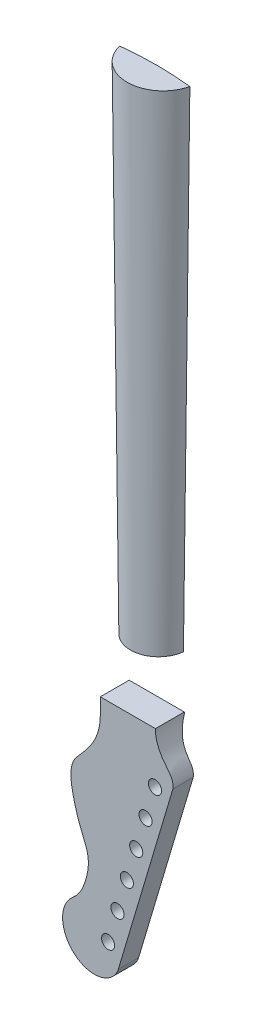
ISO-10303-21;
HEADER;
FILE_DESCRIPTION(('STEP AP214'),'2;1');
FILE_NAME('part.step','',(''),(''),'','','');
FILE_SCHEMA(('AUTOMOTIVE_DESIGN { 1 0 10303 214 1 1 1 1 }'));
ENDSEC;
DATA;
#1=APPLICATION_CONTEXT('core data for automotive mechanical design processes');
#2=APPLICATION_PROTOCOL_DEFINITION('international standard','automotive_design',2000,#1);
#3=PRODUCT_CONTEXT('',#1,'mechanical');
#4=PRODUCT('Part','Part','',(#3));
#5=PRODUCT_RELATED_PRODUCT_CATEGORY('part','',(#4));
#6=PRODUCT_DEFINITION_FORMATION('','',#4);
#7=PRODUCT_DEFINITION_CONTEXT('part definition',#1,'design');
#8=PRODUCT_DEFINITION('design','',#6,#7);
#9=PRODUCT_DEFINITION_SHAPE('','',#8);
#10=(LENGTH_UNIT() NAMED_UNIT(*) SI_UNIT(.MILLI.,.METRE.));
#11=(NAMED_UNIT(*) PLANE_ANGLE_UNIT() SI_UNIT($,.RADIAN.));
#12=(NAMED_UNIT(*) SI_UNIT($,.STERADIAN.) SOLID_ANGLE_UNIT());
#13=UNCERTAINTY_MEASURE_WITH_UNIT(LENGTH_MEASURE(1.E-05),#10,'distance_accuracy_value','');
#14=(GEOMETRIC_REPRESENTATION_CONTEXT(3) GLOBAL_UNCERTAINTY_ASSIGNED_CONTEXT((#13)) GLOBAL_UNIT_ASSIGNED_CONTEXT((#10,
#11,#12)) REPRESENTATION_CONTEXT('',''));
#15=CARTESIAN_POINT('',(0.,0.,0.));
#16=DIRECTION('',(0.,0.,1.));
#17=DIRECTION('',(1.,0.,0.));
#18=AXIS2_PLACEMENT_3D('',#15,#16,#17);
#19=CARTESIAN_POINT('',(56.6375080453473,-20.3369897013631,0.));
#20=DIRECTION('',(0.,0.,-1.));
#21=DIRECTION('',(-1.,0.,0.));
#22=AXIS2_PLACEMENT_3D('',#19,#20,#21);
#23=PLANE('',#22);
#24=CARTESIAN_POINT('',(64.4678967595988,-36.3869171248618,0.));
#25=CARTESIAN_POINT('',(65.2962653016021,-30.5662360862277,0.));
#26=CARTESIAN_POINT('',(56.4837621605687,-22.0007319523904,0.));
#27=CARTESIAN_POINT('',(50.9375501111084,-10.7673234647444,0.));
#28=CARTESIAN_POINT('',(51.151028,-3.25,0.));
#29=B_SPLINE_CURVE_WITH_KNOTS('',3,(#24,#25,#26,#27,#28),.UNSPECIFIED.,.F.,.F.,(4,1,4),(0.,
0.401837933237775,1.),.UNSPECIFIED.);
#30=CARTESIAN_POINT('',(51.1549542125218,-4.75,0.));
#31=VERTEX_POINT('',#30);
#32=CARTESIAN_POINT('',(51.151028,-3.25,0.));
#33=VERTEX_POINT('',#32);
#34=EDGE_CURVE('E241',#31,#33,#29,.T.);
#35=ORIENTED_EDGE('',*,*,#34,.F.);
#36=DIRECTION('',(-1.,0.,0.));
#37=VECTOR('',#36,1.);
#38=CARTESIAN_POINT('',(89.,-4.75,0.));
#39=LINE('',#38,#37);
#40=CARTESIAN_POINT('',(9.14908,-4.75,0.));
#41=VERTEX_POINT('',#40);
#42=EDGE_CURVE('E175',#31,#41,#39,.T.);
#43=ORIENTED_EDGE('',*,*,#42,.T.);
#44=DIRECTION('',(0.,-1.,0.));
#45=VECTOR('',#44,1.);
#46=CARTESIAN_POINT('',(9.14908,-3.25,0.));
#47=LINE('',#46,#45);
#48=CARTESIAN_POINT('',(9.14908,-3.25,0.));
#49=VERTEX_POINT('',#48);
#50=EDGE_CURVE('E157',#49,#41,#47,.T.);
#51=ORIENTED_EDGE('',*,*,#50,.F.);
#52=DIRECTION('',(-1.,0.,0.));
#53=VECTOR('',#52,1.);
#54=CARTESIAN_POINT('',(51.151028,-3.25,0.));
#55=LINE('',#54,#53);
#56=EDGE_CURVE('E321',#33,#49,#55,.T.);
#57=ORIENTED_EDGE('',*,*,#56,.F.);
#58=EDGE_LOOP('',(#35,#43,#51,#57));
#59=FACE_BOUND('',#58,.T.);
#60=ADVANCED_FACE('F51',(#59),#23,.T.);
#61=CARTESIAN_POINT('',(64.4678967595988,-36.3869171248618,22.));
#62=CARTESIAN_POINT('',(65.2962653016021,-30.5662360862277,22.));
#63=CARTESIAN_POINT('',(56.4837621605687,-22.0007319523904,22.));
#64=CARTESIAN_POINT('',(50.9375501111084,-10.7673234647444,22.));
#65=CARTESIAN_POINT('',(51.151028,-3.25,22.));
#66=B_SPLINE_CURVE_WITH_KNOTS('',3,(#61,#62,#63,#64,#65),.UNSPECIFIED.,.F.,.F.,(4,1,4),(0.,
0.401837933237775,1.),.UNSPECIFIED.);
#67=DIRECTION('',(0.,0.,-1.));
#68=VECTOR('',#67,1.);
#69=SURFACE_OF_LINEAR_EXTRUSION('',#66,#68);
#70=CARTESIAN_POINT('',(51.1549542125218,-4.75000002359859,4.21852207528305E-09));
#71=CARTESIAN_POINT('',(51.1680654468338,-5.14091643297609,0.150058757586606));
#72=CARTESIAN_POINT('',(51.1906814220311,-5.53154264494164,0.300006112774302));
#73=CARTESIAN_POINT('',(51.2545517430317,-6.31103438426002,0.599224958035812));
#74=CARTESIAN_POINT('',(51.2957855595916,-6.69990137569232,0.748497010118848));
#75=CARTESIAN_POINT('',(51.3965222496747,-7.4753379481485,1.04615922148701));
#76=CARTESIAN_POINT('',(51.4560147588833,-7.86190870602771,1.19454983252432));
#77=CARTESIAN_POINT('',(51.5927661422065,-8.63223932063184,1.4902520506242));
#78=CARTESIAN_POINT('',(51.6700224611351,-9.01599957344202,1.63756380972966));
#79=CARTESIAN_POINT('',(51.840038295133,-9.77272447515635,1.92804328389599));
#80=CARTESIAN_POINT('',(51.9324673798035,-10.1457539953343,2.07123590070518));
#81=CARTESIAN_POINT('',(52.1332053641683,-10.8881343898938,2.3562090344966));
#82=CARTESIAN_POINT('',(52.2415170784595,-11.2574845998414,2.49798929642658));
#83=CARTESIAN_POINT('',(52.4733131476984,-11.9920514774737,2.77996310207662));
#84=CARTESIAN_POINT('',(52.5967992872388,-12.3572676534475,2.92015645704661));
#85=CARTESIAN_POINT('',(52.8581714686001,-13.0831318388325,3.1987896121365));
#86=CARTESIAN_POINT('',(52.9960560072269,-13.443780320712,3.33722959362004));
#87=CARTESIAN_POINT('',(53.2798751215128,-14.1464328261318,3.60695261957817));
#88=CARTESIAN_POINT('',(53.4252932601499,-14.4886190444293,3.73830560206738));
#89=CARTESIAN_POINT('',(53.7280288740928,-15.1683273649276,3.99922118062102));
#90=CARTESIAN_POINT('',(53.8853451725619,-15.5058499245114,4.12878395225833));
#91=CARTESIAN_POINT('',(54.2112200264707,-16.176167239746,4.38609466163837));
#92=CARTESIAN_POINT('',(54.3797797481468,-16.5089615005924,4.51384240944352));
#93=CARTESIAN_POINT('',(54.7274837219142,-17.1697600424618,4.76749920407103));
#94=CARTESIAN_POINT('',(54.9066297805539,-17.4977634939578,4.89340793246781));
#95=CARTESIAN_POINT('',(55.2784161795221,-18.1552291549036,5.1457853539757));
#96=CARTESIAN_POINT('',(55.4712514860682,-18.4845951773182,5.27221712434334));
#97=CARTESIAN_POINT('',(55.8665364925132,-19.1382184097607,5.52311957574163));
#98=CARTESIAN_POINT('',(56.0689853946862,-19.4624760407143,5.64759041835047));
#99=CARTESIAN_POINT('',(56.4827947449292,-20.1058151737395,5.89454517384971));
#100=CARTESIAN_POINT('',(56.6941516381016,-20.4248986715523,6.01702985283335));
#101=CARTESIAN_POINT('',(57.1250817005319,-21.057828828609,6.25998897681674));
#102=CARTESIAN_POINT('',(57.3446480064048,-21.371679558657,6.38046498445179));
#103=CARTESIAN_POINT('',(57.5681076748866,-21.6830789205097,6.5));
#104=B_SPLINE_CURVE_WITH_KNOTS('',3,(#70,#71,#72,#73,#74,#75,#76,#77,#78,#79,#80,#81,#82,#83,
#84,#85,#86,#87,#88,#89,#90,#91,#92,#93,#94,#95,#96,#97,#98,#99,#100,#101,#102,#103),
.UNSPECIFIED.,.F.,.F.,(4,2,2,2,2,2,2,2,2,2,2,2,2,2,2,2,4),(0.,1.25667336214889,2.51196440576778,
3.76654421316922,5.02094367178069,6.25096763315607,7.48120983387477,8.71159685628633,
9.94185555435961,11.1246089514657,12.3072455160601,13.4900049422633,14.6729667913902,
15.8789869484353,17.0849072054945,18.2903506920355,19.4948079783741),.UNSPECIFIED.);
#105=CARTESIAN_POINT('',(53.9451946415747,-15.627067259028,4.17531492740211));
#106=VERTEX_POINT('',#105);
#107=EDGE_CURVE('E293',#31,#106,#104,.T.);
#108=ORIENTED_EDGE('',*,*,#107,.F.);
#109=ORIENTED_EDGE('',*,*,#34,.T.);
#110=DIRECTION('',(0.,0.,-1.));
#111=VECTOR('',#110,1.);
#112=CARTESIAN_POINT('',(51.151028,-3.25,22.));
#113=LINE('',#112,#111);
#114=CARTESIAN_POINT('',(51.151028,-3.25,22.));
#115=VERTEX_POINT('',#114);
#116=EDGE_CURVE('E164',#115,#33,#113,.T.);
#117=ORIENTED_EDGE('',*,*,#116,.F.);
#118=CARTESIAN_POINT('',(64.4678967595988,-36.3869171248618,22.));
#119=VERTEX_POINT('',#118);
#120=EDGE_CURVE('E217',#119,#115,#66,.T.);
#121=ORIENTED_EDGE('',*,*,#120,.F.);
#122=DIRECTION('',(0.,0.,-1.));
#123=VECTOR('',#122,1.);
#124=CARTESIAN_POINT('',(64.4678967595988,-36.3869171248618,22.));
#125=LINE('',#124,#123);
#126=CARTESIAN_POINT('',(64.4678967595988,-36.3869171248618,6.5));
#127=VERTEX_POINT('',#126);
#128=EDGE_CURVE('E167',#119,#127,#125,.T.);
#129=ORIENTED_EDGE('',*,*,#128,.T.);
#130=CARTESIAN_POINT('',(64.4678967595988,-36.3869171248618,6.5));
#131=CARTESIAN_POINT('',(65.2962653016021,-30.5662360862277,6.5));
#132=CARTESIAN_POINT('',(56.4837621605687,-22.0007319523904,6.5));
#133=CARTESIAN_POINT('',(50.9375501111084,-10.7673234647444,6.5));
#134=CARTESIAN_POINT('',(51.151028,-3.25,6.5));
#135=B_SPLINE_CURVE_WITH_KNOTS('',3,(#130,#131,#132,#133,#134),.UNSPECIFIED.,.F.,.F.,(4,1,4),
(0.,0.401837933237775,1.),.UNSPECIFIED.);
#136=CARTESIAN_POINT('',(62.4927121618197,-28.1699454925965,6.5));
#137=VERTEX_POINT('',#136);
#138=EDGE_CURVE('E138',#127,#137,#135,.T.);
#139=ORIENTED_EDGE('',*,*,#138,.T.);
#140=CARTESIAN_POINT('',(62.4927121610172,-28.1699454931134,6.5));
#141=CARTESIAN_POINT('',(62.375614539713,-27.9876341963071,6.49999392580149));
#142=CARTESIAN_POINT('',(62.255558318861,-27.8072669409178,6.49857546535381));
#143=CARTESIAN_POINT('',(62.0105828859032,-27.4499856605042,6.49305184864964));
#144=CARTESIAN_POINT('',(61.8856652381194,-27.2730705517058,6.48894755003454));
#145=CARTESIAN_POINT('',(61.6326274882078,-26.9230867739052,6.47821908608642));
#146=CARTESIAN_POINT('',(61.5045282261052,-26.7500025338295,6.47160859370002));
#147=CARTESIAN_POINT('',(61.2453877230433,-26.4061464062348,6.45595240036816));
#148=CARTESIAN_POINT('',(61.1143462289659,-26.2353747197049,6.44690648916389));
#149=CARTESIAN_POINT('',(60.7190525693369,-25.7268924262354,6.41628289898456));
#150=CARTESIAN_POINT('',(60.4517252212223,-25.3917867321417,6.39118044494661));
#151=CARTESIAN_POINT('',(60.0497152374659,-24.8914431801342,6.34650939088679));
#152=CARTESIAN_POINT('',(59.9157422718939,-24.7252934491955,6.33047853352343));
#153=CARTESIAN_POINT('',(59.6480543836191,-24.3930280143909,6.29601738312702));
#154=CARTESIAN_POINT('',(59.5143394631078,-24.2269123108245,6.27758706980656));
#155=CARTESIAN_POINT('',(59.2482854757439,-23.8946406176895,6.23830262335778));
#156=CARTESIAN_POINT('',(59.1159435900558,-23.7284860663392,6.21745548125596));
#157=CARTESIAN_POINT('',(58.918724686557,-23.4784915554692,6.18425177806883));
#158=CARTESIAN_POINT('',(58.8532008986447,-23.3950331865278,6.17286174864829));
#159=CARTESIAN_POINT('',(58.7226849015026,-23.2277945228981,6.14941952711127));
#160=CARTESIAN_POINT('',(58.6576926923494,-23.1440142281634,6.13736733489942));
#161=CARTESIAN_POINT('',(58.4638244243858,-22.8925236884775,6.10025289660904));
#162=CARTESIAN_POINT('',(58.335781907922,-22.7243161156035,6.07418668345491));
#163=CARTESIAN_POINT('',(58.0820206129897,-22.3866035608632,6.01930218003816));
#164=CARTESIAN_POINT('',(57.9563018640345,-22.2170985625572,5.99048385485059));
#165=CARTESIAN_POINT('',(57.5818311077652,-21.7053461997294,5.89955430165509));
#166=CARTESIAN_POINT('',(57.3367558274747,-21.3611453902544,5.83315671393475));
#167=CARTESIAN_POINT('',(56.8573766901676,-20.6679315543294,5.68837713837883));
#168=CARTESIAN_POINT('',(56.6230700943603,-20.318919781131,5.60999821992936));
#169=CARTESIAN_POINT('',(56.1658046654258,-19.6159195207824,5.44052917996557));
#170=CARTESIAN_POINT('',(55.9428601443982,-19.2619254403392,5.34942354238842));
#171=CARTESIAN_POINT('',(55.5089305766262,-18.5488187663214,5.15369283654371));
#172=CARTESIAN_POINT('',(55.2979832577829,-18.1896940385724,5.04902818317029));
#173=CARTESIAN_POINT('',(54.8886907547745,-17.4661761882196,4.82526649273988));
#174=CARTESIAN_POINT('',(54.6904145912704,-17.1017656187782,4.7060992411768));
#175=CARTESIAN_POINT('',(54.3071146221356,-16.3675770329247,4.45233203398029));
#176=CARTESIAN_POINT('',(54.1222004790933,-15.9977792544597,4.31762377971412));
#177=CARTESIAN_POINT('',(53.9451946415747,-15.6270672590279,4.17531492740206));
#178=B_SPLINE_CURVE_WITH_KNOTS('',3,(#140,#141,#142,#143,#144,#145,#146,#147,#148,#149,#150,
#151,#152,#153,#154,#155,#156,#157,#158,#159,#160,#161,#162,#163,#164,#165,#166,#167,#168,#169,
#170,#171,#172,#173,#174,#175,#176,#177),.UNSPECIFIED.,.F.,.F.,(4,2,2,2,2,2,2,2,2,2,2,2,2,2,2,2,
2,2,4),(0.,0.649946905278127,1.29968637082793,1.94593093055724,2.59223130089823,
3.88025543201119,4.52235862228419,5.16446724189611,5.80476275554744,6.12490861336931,
6.44505451730247,7.08400981305202,7.72297321837733,9.00579587777505,10.288290451773,
11.5723624800126,12.8602715580577,14.1546845941654,15.4587352324983),.UNSPECIFIED.);
#179=EDGE_CURVE('E190',#137,#106,#178,.T.);
#180=ORIENTED_EDGE('',*,*,#179,.T.);
#181=EDGE_LOOP('',(#108,#109,#117,#121,#129,#139,#180));
#182=FACE_BOUND('',#181,.T.);
#183=ADVANCED_FACE('F206',(#182),#69,.F.);
#184=CARTESIAN_POINT('',(9.14908,-3.25,22.));
#185=DIRECTION('',(1.,0.,0.));
#186=DIRECTION('',(0.,0.,-1.));
#187=AXIS2_PLACEMENT_3D('',#184,#185,#186);
#188=PLANE('',#187);
#189=DIRECTION('',(0.,0.933580426497202,-0.358367949545301));
#190=VECTOR('',#189,1.);
#191=CARTESIAN_POINT('',(9.14908,-10.8030780508394,2.32355896497953));
#192=LINE('',#191,#190);
#193=CARTESIAN_POINT('',(9.14908,-15.6270672590279,4.17531492740205));
#194=VERTEX_POINT('',#193);
#195=EDGE_CURVE('E302',#194,#41,#192,.T.);
#196=ORIENTED_EDGE('',*,*,#195,.F.);
#197=CARTESIAN_POINT('',(9.14908,-28.1699454931134,-28.5));
#198=DIRECTION('',(1.,0.,0.));
#199=DIRECTION('',(0.,0.,-1.));
#200=AXIS2_PLACEMENT_3D('',#197,#198,#199);
#201=CIRCLE('',#200,35.);
#202=CARTESIAN_POINT('',(9.14908,-15.8461860828899,4.25858595847703));
#203=VERTEX_POINT('',#202);
#204=EDGE_CURVE('E180',#194,#203,#201,.T.);
#205=ORIENTED_EDGE('',*,*,#204,.T.);
#206=DIRECTION('',(0.,0.,-1.));
#207=VECTOR('',#206,1.);
#208=CARTESIAN_POINT('',(9.14908,-15.8461860828899,22.));
#209=LINE('',#208,#207);
#210=CARTESIAN_POINT('',(9.14908,-15.8461860828899,22.));
#211=VERTEX_POINT('',#210);
#212=EDGE_CURVE('E152',#211,#203,#209,.T.);
#213=ORIENTED_EDGE('',*,*,#212,.F.);
#214=DIRECTION('',(0.,-1.,0.));
#215=VECTOR('',#214,1.);
#216=CARTESIAN_POINT('',(9.14908,-3.25,22.));
#217=LINE('',#216,#215);
#218=CARTESIAN_POINT('',(9.14908,-3.25,22.));
#219=VERTEX_POINT('',#218);
#220=EDGE_CURVE('E230',#219,#211,#217,.T.);
#221=ORIENTED_EDGE('',*,*,#220,.F.);
#222=DIRECTION('',(0.,0.,-1.));
#223=VECTOR('',#222,1.);
#224=CARTESIAN_POINT('',(9.14908,-3.25,22.));
#225=LINE('',#224,#223);
#226=EDGE_CURVE('E161',#219,#49,#225,.T.);
#227=ORIENTED_EDGE('',*,*,#226,.T.);
#228=ORIENTED_EDGE('',*,*,#50,.T.);
#229=EDGE_LOOP('',(#196,#205,#213,#221,#227,#228));
#230=FACE_BOUND('',#229,.T.);
#231=ADVANCED_FACE('F212',(#230),#188,.F.);
#232=CARTESIAN_POINT('',(9.14908,-15.8461860828899,22.));
#233=CARTESIAN_POINT('',(9.14155036327025,-28.5011520733973,22.));
#234=CARTESIAN_POINT('',(1.42040319634674,-41.254700500389,22.));
#235=CARTESIAN_POINT('',(-15.1493368929048,-58.1713070603134,22.));
#236=CARTESIAN_POINT('',(-12.0269211377536,-78.7635919098304,22.));
#237=CARTESIAN_POINT('',(-6.30179242998799,-97.3658769245577,22.));
#238=CARTESIAN_POINT('',(3.42838025713822,-117.152927922777,22.));
#239=CARTESIAN_POINT('',(-3.25555181730968,-134.645669988056,22.));
#240=CARTESIAN_POINT('',(-6.00743272714509,-139.183931521686,22.));
#241=B_SPLINE_CURVE_WITH_KNOTS('',3,(#232,#233,#234,#235,#236,#237,#238,#239,#240),
.UNSPECIFIED.,.F.,.F.,(4,1,1,1,1,1,4),(0.,0.241122101621908,0.315889976992155,0.476811466885725,
0.625347755042572,0.735303781085615,0.929974714109899),.UNSPECIFIED.);
#242=DIRECTION('',(0.,0.,-1.));
#243=VECTOR('',#242,1.);
#244=SURFACE_OF_LINEAR_EXTRUSION('',#241,#243);
#245=ORIENTED_EDGE('',*,*,#212,.T.);
#246=CARTESIAN_POINT('',(9.14908,-15.8461860828899,4.25858595847703));
#247=CARTESIAN_POINT('',(9.14883167719956,-16.3195132139063,4.43668156838662));
#248=CARTESIAN_POINT('',(9.14027947279793,-16.7967488882606,4.60447715627266));
#249=CARTESIAN_POINT('',(9.10553736017694,-17.7577313621911,4.91917186077467));
#250=CARTESIAN_POINT('',(9.07933714293539,-18.241481805391,5.06605870283946));
#251=CARTESIAN_POINT('',(9.0082599088113,-19.2137271647781,5.33845735664133));
#252=CARTESIAN_POINT('',(8.96337918567037,-19.7022230036693,5.46396491970921));
#253=CARTESIAN_POINT('',(8.85530163047416,-20.6722759980036,5.69105222724623));
#254=CARTESIAN_POINT('',(8.79249074252379,-21.1537754794646,5.79306189360312));
#255=CARTESIAN_POINT('',(8.64780515284985,-22.1177086255033,5.97623897238455));
#256=CARTESIAN_POINT('',(8.56593654790622,-22.6001419424917,6.05741303293016));
#257=CARTESIAN_POINT('',(8.38299307131483,-23.5641813526218,6.19905108596458));
#258=CARTESIAN_POINT('',(8.28192745010533,-24.0457877319153,6.25952501402919));
#259=CARTESIAN_POINT('',(8.10104229546559,-24.8314752518843,6.34176910078759));
#260=CARTESIAN_POINT('',(8.02691235819212,-25.1362574999607,6.36961156599955));
#261=CARTESIAN_POINT('',(7.8710458337277,-25.7444607079303,6.41718827883975));
#262=CARTESIAN_POINT('',(7.78931051504127,-26.0478818860192,6.43692387565308));
#263=CARTESIAN_POINT('',(7.6176081814296,-26.655653245464,6.46856176686102));
#264=CARTESIAN_POINT('',(7.52757569855734,-26.9599885184397,6.48039437122008));
#265=CARTESIAN_POINT('',(7.34006255615259,-27.5666060574557,6.49611565996879));
#266=CARTESIAN_POINT('',(7.24258094861845,-27.8688880568412,6.50000333150604));
#267=CARTESIAN_POINT('',(7.14147144112366,-28.1699454932407,6.5));
#268=B_SPLINE_CURVE_WITH_KNOTS('',3,(#246,#247,#248,#249,#250,#251,#252,#253,#254,#255,#256,
#257,#258,#259,#260,#261,#262,#263,#264,#265,#266,#267),.UNSPECIFIED.,.F.,.F.,(4,2,2,2,2,2,2,2,
2,2,4),(0.,1.51703699412055,3.03496092924874,4.55318616788805,6.04092088248463,7.52818030636003,
9.01472487648613,9.95924844739427,10.9036147622746,11.8562024365116,12.808911542933),.UNSPECIFIED.);
#269=CARTESIAN_POINT('',(7.14147144110607,-28.169945493293,6.5));
#270=VERTEX_POINT('',#269);
#271=EDGE_CURVE('E183',#203,#270,#268,.T.);
#272=ORIENTED_EDGE('',*,*,#271,.T.);
#273=CARTESIAN_POINT('',(9.14908,-15.8461860828899,6.5));
#274=CARTESIAN_POINT('',(9.14155036327025,-28.5011520733973,6.5));
#275=CARTESIAN_POINT('',(1.42040319634674,-41.254700500389,6.5));
#276=CARTESIAN_POINT('',(-15.1493368929048,-58.1713070603134,6.5));
#277=CARTESIAN_POINT('',(-12.0269211377536,-78.7635919098304,6.5));
#278=CARTESIAN_POINT('',(-6.30179242998799,-97.3658769245577,6.5));
#279=CARTESIAN_POINT('',(3.42838025713822,-117.152927922777,6.5));
#280=CARTESIAN_POINT('',(-3.25555181730968,-134.645669988056,6.5));
#281=CARTESIAN_POINT('',(-6.00743272714509,-139.183931521686,6.5));
#282=B_SPLINE_CURVE_WITH_KNOTS('',3,(#273,#274,#275,#276,#277,#278,#279,#280,#281),
.UNSPECIFIED.,.F.,.F.,(4,1,1,1,1,1,4),(0.,0.241122101621908,0.315889976992155,0.476811466885725,
0.625347755042572,0.735303781085615,0.929974714109899),.UNSPECIFIED.);
#283=CARTESIAN_POINT('',(-6.0074327271451,-139.183931521686,6.5));
#284=VERTEX_POINT('',#283);
#285=EDGE_CURVE('E147',#270,#284,#282,.T.);
#286=ORIENTED_EDGE('',*,*,#285,.T.);
#287=DIRECTION('',(0.,0.,-1.));
#288=VECTOR('',#287,1.);
#289=CARTESIAN_POINT('',(-6.00743272714511,-139.183931521686,22.));
#290=LINE('',#289,#288);
#291=CARTESIAN_POINT('',(-6.00743272714511,-139.183931521686,22.));
#292=VERTEX_POINT('',#291);
#293=EDGE_CURVE('E146',#292,#284,#290,.T.);
#294=ORIENTED_EDGE('',*,*,#293,.F.);
#295=EDGE_CURVE('E231',#211,#292,#241,.T.);
#296=ORIENTED_EDGE('',*,*,#295,.F.);
#297=EDGE_LOOP('',(#245,#272,#286,#294,#296));
#298=FACE_BOUND('',#297,.T.);
#299=ADVANCED_FACE('F197',(#298),#244,.F.);
#300=CARTESIAN_POINT('',(56.6375080453473,-20.3369897013631,22.));
#301=DIRECTION('',(0.,0.,-1.));
#302=DIRECTION('',(-1.,0.,0.));
#303=AXIS2_PLACEMENT_3D('',#300,#301,#302);
#304=PLANE('',#303);
#305=CARTESIAN_POINT('',(2.82778361815029,-165.10940239539,22.));
#306=DIRECTION('',(0.,0.,1.));
#307=DIRECTION('',(0.492719665115745,-0.870188101279389,0.));
#308=AXIS2_PLACEMENT_3D('',#305,#306,#307);
#309=ELLIPSE('',#308,24.0145747821876,21.8622032851158);
#310=CARTESIAN_POINT('',(-12.1506616742416,-146.419210188161,22.));
#311=VERTEX_POINT('',#310);
#312=CARTESIAN_POINT('',(19.4412668680975,-182.232634909366,22.));
#313=VERTEX_POINT('',#312);
#314=EDGE_CURVE('E150',#311,#313,#309,.T.);
#315=ORIENTED_EDGE('',*,*,#314,.T.);
#316=CARTESIAN_POINT('',(8.47371639429525,-171.999705875869,22.));
#317=DIRECTION('',(0.,0.,-1.));
#318=DIRECTION('',(-1.,0.,0.));
#319=AXIS2_PLACEMENT_3D('',#316,#317,#318);
#320=CIRCLE('',#319,15.);
#321=CARTESIAN_POINT('',(22.8509752570106,-176.276904444379,22.));
#322=VERTEX_POINT('',#321);
#323=EDGE_CURVE('E12',#313,#322,#320,.F.);
#324=ORIENTED_EDGE('',*,*,#323,.T.);
#325=DIRECTION('',(0.285146571234047,0.95848392418103,0.));
#326=VECTOR('',#325,1.);
#327=CARTESIAN_POINT('',(61.8224691280819,-45.2791855691915,22.));
#328=LINE('',#327,#326);
#329=EDGE_CURVE('E224',#322,#119,#328,.T.);
#330=ORIENTED_EDGE('',*,*,#329,.T.);
#331=ORIENTED_EDGE('',*,*,#120,.T.);
#332=DIRECTION('',(-1.,0.,0.));
#333=VECTOR('',#332,1.);
#334=CARTESIAN_POINT('',(51.151028,-3.25,22.));
#335=LINE('',#334,#333);
#336=EDGE_CURVE('E223',#115,#219,#335,.T.);
#337=ORIENTED_EDGE('',*,*,#336,.T.);
#338=ORIENTED_EDGE('',*,*,#220,.T.);
#339=ORIENTED_EDGE('',*,*,#295,.T.);
#340=CARTESIAN_POINT('',(-31.6598108182429,-123.629012741076,22.));
#341=DIRECTION('',(0.,0.,-1.));
#342=DIRECTION('',(1.,0.,0.));
#343=AXIS2_PLACEMENT_3D('',#340,#341,#342);
#344=CIRCLE('',#343,30.);
#345=EDGE_CURVE('E154',#292,#311,#344,.T.);
#346=ORIENTED_EDGE('',*,*,#345,.T.);
#347=EDGE_LOOP('',(#315,#324,#330,#331,#337,#338,#339,#346));
#348=FACE_BOUND('',#347,.T.);
#349=CARTESIAN_POINT('',(50.799904,-42.,22.));
#350=DIRECTION('',(0.,0.,1.));
#351=DIRECTION('',(1.,0.,0.));
#352=AXIS2_PLACEMENT_3D('',#349,#350,#351);
#353=CIRCLE('',#352,5.);
#354=CARTESIAN_POINT('',(55.799904,-42.,22.));
#355=VERTEX_POINT('',#354);
#356=EDGE_CURVE('E317',#355,#355,#353,.T.);
#357=ORIENTED_EDGE('',*,*,#356,.F.);
#358=EDGE_LOOP('',(#357));
#359=FACE_BOUND('',#358,.T.);
#360=CARTESIAN_POINT('',(43.659964,-66.,22.));
#361=DIRECTION('',(0.,0.,1.));
#362=DIRECTION('',(1.,0.,0.));
#363=AXIS2_PLACEMENT_3D('',#360,#361,#362);
#364=CIRCLE('',#363,5.);
#365=CARTESIAN_POINT('',(48.659964,-66.,22.));
#366=VERTEX_POINT('',#365);
#367=EDGE_CURVE('E315',#366,#366,#364,.T.);
#368=ORIENTED_EDGE('',*,*,#367,.F.);
#369=EDGE_LOOP('',(#368));
#370=FACE_BOUND('',#369,.T.);
#371=CARTESIAN_POINT('',(36.520024,-90.,22.));
#372=DIRECTION('',(0.,0.,1.));
#373=DIRECTION('',(1.,0.,0.));
#374=AXIS2_PLACEMENT_3D('',#371,#372,#373);
#375=CIRCLE('',#374,5.);
#376=CARTESIAN_POINT('',(41.520024,-90.,22.));
#377=VERTEX_POINT('',#376);
#378=EDGE_CURVE('E312',#377,#377,#375,.T.);
#379=ORIENTED_EDGE('',*,*,#378,.F.);
#380=EDGE_LOOP('',(#379));
#381=FACE_BOUND('',#380,.T.);
#382=CARTESIAN_POINT('',(29.380084,-114.,22.));
#383=DIRECTION('',(0.,0.,1.));
#384=DIRECTION('',(1.,0.,0.));
#385=AXIS2_PLACEMENT_3D('',#382,#383,#384);
#386=CIRCLE('',#385,5.);
#387=CARTESIAN_POINT('',(34.380084,-114.,22.));
#388=VERTEX_POINT('',#387);
#389=EDGE_CURVE('E309',#388,#388,#386,.T.);
#390=ORIENTED_EDGE('',*,*,#389,.F.);
#391=EDGE_LOOP('',(#390));
#392=FACE_BOUND('',#391,.T.);
#393=CARTESIAN_POINT('',(22.240144,-138.,22.));
#394=DIRECTION('',(0.,0.,1.));
#395=DIRECTION('',(1.,0.,0.));
#396=AXIS2_PLACEMENT_3D('',#393,#394,#395);
#397=CIRCLE('',#396,5.);
#398=CARTESIAN_POINT('',(27.240144,-138.,22.));
#399=VERTEX_POINT('',#398);
#400=EDGE_CURVE('E306',#399,#399,#397,.T.);
#401=ORIENTED_EDGE('',*,*,#400,.F.);
#402=EDGE_LOOP('',(#401));
#403=FACE_BOUND('',#402,.T.);
#404=CARTESIAN_POINT('',(15.100204,-162.,22.));
#405=DIRECTION('',(0.,0.,1.));
#406=DIRECTION('',(1.,0.,0.));
#407=AXIS2_PLACEMENT_3D('',#404,#405,#406);
#408=CIRCLE('',#407,5.);
#409=CARTESIAN_POINT('',(20.100204,-162.,22.));
#410=VERTEX_POINT('',#409);
#411=EDGE_CURVE('E301',#410,#410,#408,.T.);
#412=ORIENTED_EDGE('',*,*,#411,.F.);
#413=EDGE_LOOP('',(#412));
#414=FACE_BOUND('',#413,.T.);
#415=ADVANCED_FACE('F253',(#348,#359,#370,#381,#392,#403,#414),#304,.F.);
#416=CARTESIAN_POINT('',(51.151028,-3.25,22.));
#417=DIRECTION('',(0.,-1.,0.));
#418=DIRECTION('',(1.,0.,0.));
#419=AXIS2_PLACEMENT_3D('',#416,#417,#418);
#420=PLANE('',#419);
#421=ORIENTED_EDGE('',*,*,#56,.T.);
#422=ORIENTED_EDGE('',*,*,#226,.F.);
#423=ORIENTED_EDGE('',*,*,#336,.F.);
#424=ORIENTED_EDGE('',*,*,#116,.T.);
#425=EDGE_LOOP('',(#421,#422,#423,#424));
#426=FACE_BOUND('',#425,.T.);
#427=ADVANCED_FACE('F214',(#426),#420,.F.);
#428=CARTESIAN_POINT('',(-31.6598108182429,-123.629012741076,22.));
#429=DIRECTION('',(0.,0.,-1.));
#430=DIRECTION('',(-1.,0.,0.));
#431=AXIS2_PLACEMENT_3D('',#428,#429,#430);
#432=CYLINDRICAL_SURFACE('',#431,30.);
#433=ORIENTED_EDGE('',*,*,#293,.T.);
#434=CARTESIAN_POINT('',(-31.6598108182429,-123.629012741076,6.5));
#435=DIRECTION('',(0.,0.,1.));
#436=DIRECTION('',(0.,-1.,0.));
#437=AXIS2_PLACEMENT_3D('',#434,#435,#436);
#438=CIRCLE('',#437,30.);
#439=CARTESIAN_POINT('',(-12.1506616742416,-146.419210188161,6.5));
#440=VERTEX_POINT('',#439);
#441=EDGE_CURVE('E135',#284,#440,#438,.F.);
#442=ORIENTED_EDGE('',*,*,#441,.T.);
#443=DIRECTION('',(0.,0.,-1.));
#444=VECTOR('',#443,1.);
#445=CARTESIAN_POINT('',(-12.1506616742416,-146.419210188161,22.));
#446=LINE('',#445,#444);
#447=EDGE_CURVE('E144',#311,#440,#446,.T.);
#448=ORIENTED_EDGE('',*,*,#447,.F.);
#449=ORIENTED_EDGE('',*,*,#345,.F.);
#450=EDGE_LOOP('',(#433,#442,#448,#449));
#451=FACE_BOUND('',#450,.T.);
#452=ADVANCED_FACE('F142',(#451),#432,.F.);
#453=DIRECTION('',(0.,0.,-1.));
#454=VECTOR('',#453,1.);
#455=SURFACE_OF_LINEAR_EXTRUSION('',#309,#454);
#456=CARTESIAN_POINT('',(2.82778361815029,-165.10940239539,6.5));
#457=DIRECTION('',(0.,0.,1.));
#458=DIRECTION('',(0.492719665115745,-0.870188101279389,0.));
#459=AXIS2_PLACEMENT_3D('',#456,#457,#458);
#460=ELLIPSE('',#459,24.0145747821876,21.8622032851158);
#461=CARTESIAN_POINT('',(19.4412668680975,-182.232634909366,6.5));
#462=VERTEX_POINT('',#461);
#463=EDGE_CURVE('E131',#440,#462,#460,.T.);
#464=ORIENTED_EDGE('',*,*,#463,.T.);
#465=DIRECTION('',(0.,0.,-1.));
#466=VECTOR('',#465,1.);
#467=CARTESIAN_POINT('',(19.4412668680975,-182.232634909366,6.5));
#468=LINE('',#467,#466);
#469=EDGE_CURVE('E59',#462,#313,#468,.F.);
#470=ORIENTED_EDGE('',*,*,#469,.T.);
#471=ORIENTED_EDGE('',*,*,#314,.F.);
#472=ORIENTED_EDGE('',*,*,#447,.T.);
#473=EDGE_LOOP('',(#464,#470,#471,#472));
#474=FACE_BOUND('',#473,.T.);
#475=ADVANCED_FACE('F149',(#474),#455,.F.);
#476=CARTESIAN_POINT('',(61.8224691280819,-45.2791855691915,22.));
#477=DIRECTION('',(-0.95848392418103,0.285146571234046,0.));
#478=DIRECTION('',(-0.285146571234046,-0.95848392418103,0.));
#479=AXIS2_PLACEMENT_3D('',#476,#477,#478);
#480=PLANE('',#479);
#481=ORIENTED_EDGE('',*,*,#329,.F.);
#482=DIRECTION('',(0.,0.,-1.));
#483=VECTOR('',#482,1.);
#484=CARTESIAN_POINT('',(22.8509752570107,-176.276904444379,22.));
#485=LINE('',#484,#483);
#486=CARTESIAN_POINT('',(22.8509752570107,-176.276904444379,6.5));
#487=VERTEX_POINT('',#486);
#488=EDGE_CURVE('E342',#322,#487,#485,.T.);
#489=ORIENTED_EDGE('',*,*,#488,.T.);
#490=DIRECTION('',(0.285146571234046,0.95848392418103,0.));
#491=VECTOR('',#490,1.);
#492=CARTESIAN_POINT('',(61.8224691280819,-45.2791855691915,6.5));
#493=LINE('',#492,#491);
#494=EDGE_CURVE('E340',#487,#127,#493,.T.);
#495=ORIENTED_EDGE('',*,*,#494,.T.);
#496=ORIENTED_EDGE('',*,*,#128,.F.);
#497=EDGE_LOOP('',(#481,#489,#495,#496));
#498=FACE_BOUND('',#497,.T.);
#499=ADVANCED_FACE('F247',(#498),#480,.F.);
#500=CARTESIAN_POINT('',(50.799904,-42.,22.));
#501=DIRECTION('',(0.,0.,-1.));
#502=DIRECTION('',(-1.,0.,0.));
#503=AXIS2_PLACEMENT_3D('',#500,#501,#502);
#504=CYLINDRICAL_SURFACE('',#503,5.);
#505=CARTESIAN_POINT('',(50.799904,-42.,6.5));
#506=DIRECTION('',(0.,0.,1.));
#507=DIRECTION('',(0.,-1.,0.));
#508=AXIS2_PLACEMENT_3D('',#505,#506,#507);
#509=CIRCLE('',#508,5.);
#510=CARTESIAN_POINT('',(50.799904,-47.,6.5));
#511=VERTEX_POINT('',#510);
#512=EDGE_CURVE('E343',#511,#511,#509,.T.);
#513=ORIENTED_EDGE('',*,*,#512,.F.);
#514=EDGE_LOOP('',(#513));
#515=FACE_BOUND('',#514,.T.);
#516=ORIENTED_EDGE('',*,*,#356,.T.);
#517=EDGE_LOOP('',(#516));
#518=FACE_BOUND('',#517,.T.);
#519=ADVANCED_FACE('F264',(#515,#518),#504,.F.);
#520=CARTESIAN_POINT('',(43.659964,-66.,22.));
#521=DIRECTION('',(0.,0.,-1.));
#522=DIRECTION('',(-1.,0.,0.));
#523=AXIS2_PLACEMENT_3D('',#520,#521,#522);
#524=CYLINDRICAL_SURFACE('',#523,5.);
#525=CARTESIAN_POINT('',(43.659964,-66.,6.5));
#526=DIRECTION('',(0.,0.,1.));
#527=DIRECTION('',(0.,-1.,0.));
#528=AXIS2_PLACEMENT_3D('',#525,#526,#527);
#529=CIRCLE('',#528,5.);
#530=CARTESIAN_POINT('',(43.659964,-71.,6.5));
#531=VERTEX_POINT('',#530);
#532=EDGE_CURVE('E371',#531,#531,#529,.T.);
#533=ORIENTED_EDGE('',*,*,#532,.F.);
#534=EDGE_LOOP('',(#533));
#535=FACE_BOUND('',#534,.T.);
#536=ORIENTED_EDGE('',*,*,#367,.T.);
#537=EDGE_LOOP('',(#536));
#538=FACE_BOUND('',#537,.T.);
#539=ADVANCED_FACE('F267',(#535,#538),#524,.F.);
#540=CARTESIAN_POINT('',(36.520024,-90.,22.));
#541=DIRECTION('',(0.,0.,-1.));
#542=DIRECTION('',(-1.,0.,0.));
#543=AXIS2_PLACEMENT_3D('',#540,#541,#542);
#544=CYLINDRICAL_SURFACE('',#543,5.);
#545=CARTESIAN_POINT('',(36.520024,-90.,6.5));
#546=DIRECTION('',(0.,0.,1.));
#547=DIRECTION('',(0.,-1.,0.));
#548=AXIS2_PLACEMENT_3D('',#545,#546,#547);
#549=CIRCLE('',#548,5.);
#550=CARTESIAN_POINT('',(36.520024,-95.,6.5));
#551=VERTEX_POINT('',#550);
#552=EDGE_CURVE('E368',#551,#551,#549,.T.);
#553=ORIENTED_EDGE('',*,*,#552,.F.);
#554=EDGE_LOOP('',(#553));
#555=FACE_BOUND('',#554,.T.);
#556=ORIENTED_EDGE('',*,*,#378,.T.);
#557=EDGE_LOOP('',(#556));
#558=FACE_BOUND('',#557,.T.);
#559=ADVANCED_FACE('F271',(#555,#558),#544,.F.);
#560=CARTESIAN_POINT('',(29.380084,-114.,22.));
#561=DIRECTION('',(0.,0.,-1.));
#562=DIRECTION('',(-1.,0.,0.));
#563=AXIS2_PLACEMENT_3D('',#560,#561,#562);
#564=CYLINDRICAL_SURFACE('',#563,5.);
#565=CARTESIAN_POINT('',(29.380084,-114.,6.5));
#566=DIRECTION('',(0.,0.,1.));
#567=DIRECTION('',(0.,-1.,0.));
#568=AXIS2_PLACEMENT_3D('',#565,#566,#567);
#569=CIRCLE('',#568,5.);
#570=CARTESIAN_POINT('',(29.380084,-119.,6.5));
#571=VERTEX_POINT('',#570);
#572=EDGE_CURVE('E365',#571,#571,#569,.T.);
#573=ORIENTED_EDGE('',*,*,#572,.F.);
#574=EDGE_LOOP('',(#573));
#575=FACE_BOUND('',#574,.T.);
#576=ORIENTED_EDGE('',*,*,#389,.T.);
#577=EDGE_LOOP('',(#576));
#578=FACE_BOUND('',#577,.T.);
#579=ADVANCED_FACE('F275',(#575,#578),#564,.F.);
#580=CARTESIAN_POINT('',(22.240144,-138.,22.));
#581=DIRECTION('',(0.,0.,-1.));
#582=DIRECTION('',(-1.,0.,0.));
#583=AXIS2_PLACEMENT_3D('',#580,#581,#582);
#584=CYLINDRICAL_SURFACE('',#583,5.);
#585=CARTESIAN_POINT('',(22.240144,-138.,6.5));
#586=DIRECTION('',(0.,0.,1.));
#587=DIRECTION('',(0.,-1.,0.));
#588=AXIS2_PLACEMENT_3D('',#585,#586,#587);
#589=CIRCLE('',#588,5.);
#590=CARTESIAN_POINT('',(22.240144,-143.,6.5));
#591=VERTEX_POINT('',#590);
#592=EDGE_CURVE('E174',#591,#591,#589,.T.);
#593=ORIENTED_EDGE('',*,*,#592,.F.);
#594=EDGE_LOOP('',(#593));
#595=FACE_BOUND('',#594,.T.);
#596=ORIENTED_EDGE('',*,*,#400,.T.);
#597=EDGE_LOOP('',(#596));
#598=FACE_BOUND('',#597,.T.);
#599=ADVANCED_FACE('F279',(#595,#598),#584,.F.);
#600=CARTESIAN_POINT('',(15.100204,-162.,22.));
#601=DIRECTION('',(0.,0.,-1.));
#602=DIRECTION('',(-1.,0.,0.));
#603=AXIS2_PLACEMENT_3D('',#600,#601,#602);
#604=CYLINDRICAL_SURFACE('',#603,5.);
#605=CARTESIAN_POINT('',(15.100204,-162.,6.5));
#606=DIRECTION('',(0.,0.,1.));
#607=DIRECTION('',(0.,-1.,0.));
#608=AXIS2_PLACEMENT_3D('',#605,#606,#607);
#609=CIRCLE('',#608,5.);
#610=CARTESIAN_POINT('',(15.100204,-167.,6.5));
#611=VERTEX_POINT('',#610);
#612=EDGE_CURVE('E171',#611,#611,#609,.T.);
#613=ORIENTED_EDGE('',*,*,#612,.F.);
#614=EDGE_LOOP('',(#613));
#615=FACE_BOUND('',#614,.T.);
#616=ORIENTED_EDGE('',*,*,#411,.T.);
#617=EDGE_LOOP('',(#616));
#618=FACE_BOUND('',#617,.T.);
#619=ADVANCED_FACE('F283',(#615,#618),#604,.F.);
#620=CARTESIAN_POINT('',(89.,-0.610031039491191,-1.58918519010229));
#621=DIRECTION('',(0.,-0.358367949545301,-0.933580426497202));
#622=DIRECTION('',(0.,0.933580426497202,-0.358367949545301));
#623=AXIS2_PLACEMENT_3D('',#620,#621,#622);
#624=PLANE('',#623);
#625=ORIENTED_EDGE('',*,*,#107,.T.);
#626=DIRECTION('',(-1.,0.,0.));
#627=VECTOR('',#626,1.);
#628=CARTESIAN_POINT('',(89.,-15.6270672590279,4.17531492740206));
#629=LINE('',#628,#627);
#630=EDGE_CURVE('E170',#106,#194,#629,.T.);
#631=ORIENTED_EDGE('',*,*,#630,.T.);
#632=ORIENTED_EDGE('',*,*,#195,.T.);
#633=ORIENTED_EDGE('',*,*,#42,.F.);
#634=EDGE_LOOP('',(#625,#631,#632,#633));
#635=FACE_BOUND('',#634,.T.);
#636=ADVANCED_FACE('F287',(#635),#624,.T.);
#637=CARTESIAN_POINT('',(89.,0.,6.5));
#638=DIRECTION('',(0.,0.,1.));
#639=DIRECTION('',(0.,-1.,0.));
#640=AXIS2_PLACEMENT_3D('',#637,#638,#639);
#641=PLANE('',#640);
#642=ORIENTED_EDGE('',*,*,#512,.T.);
#643=EDGE_LOOP('',(#642));
#644=FACE_BOUND('',#643,.T.);
#645=ORIENTED_EDGE('',*,*,#532,.T.);
#646=EDGE_LOOP('',(#645));
#647=FACE_BOUND('',#646,.T.);
#648=ORIENTED_EDGE('',*,*,#552,.T.);
#649=EDGE_LOOP('',(#648));
#650=FACE_BOUND('',#649,.T.);
#651=ORIENTED_EDGE('',*,*,#572,.T.);
#652=EDGE_LOOP('',(#651));
#653=FACE_BOUND('',#652,.T.);
#654=ORIENTED_EDGE('',*,*,#592,.T.);
#655=EDGE_LOOP('',(#654));
#656=FACE_BOUND('',#655,.T.);
#657=ORIENTED_EDGE('',*,*,#612,.T.);
#658=EDGE_LOOP('',(#657));
#659=FACE_BOUND('',#658,.T.);
#660=ORIENTED_EDGE('',*,*,#494,.F.);
#661=CARTESIAN_POINT('',(8.47371639429525,-171.999705875869,6.5));
#662=DIRECTION('',(0.,0.,1.));
#663=DIRECTION('',(0.,-1.,0.));
#664=AXIS2_PLACEMENT_3D('',#661,#662,#663);
#665=CIRCLE('',#664,15.);
#666=EDGE_CURVE('E73',#487,#462,#665,.F.);
#667=ORIENTED_EDGE('',*,*,#666,.T.);
#668=ORIENTED_EDGE('',*,*,#463,.F.);
#669=ORIENTED_EDGE('',*,*,#441,.F.);
#670=ORIENTED_EDGE('',*,*,#285,.F.);
#671=DIRECTION('',(-1.,0.,0.));
#672=VECTOR('',#671,1.);
#673=CARTESIAN_POINT('',(89.,-28.1699454931134,6.5));
#674=LINE('',#673,#672);
#675=EDGE_CURVE('E178',#270,#137,#674,.F.);
#676=ORIENTED_EDGE('',*,*,#675,.T.);
#677=ORIENTED_EDGE('',*,*,#138,.F.);
#678=EDGE_LOOP('',(#660,#667,#668,#669,#670,#676,#677));
#679=FACE_BOUND('',#678,.T.);
#680=ADVANCED_FACE('F133',(#644,#647,#650,#653,#656,#659,#679),#641,.F.);
#681=CARTESIAN_POINT('',(89.,-28.1699454931134,-28.5));
#682=DIRECTION('',(-1.,0.,0.));
#683=DIRECTION('',(0.,0.,1.));
#684=AXIS2_PLACEMENT_3D('',#681,#682,#683);
#685=CYLINDRICAL_SURFACE('',#684,35.);
#686=ORIENTED_EDGE('',*,*,#179,.F.);
#687=ORIENTED_EDGE('',*,*,#675,.F.);
#688=ORIENTED_EDGE('',*,*,#271,.F.);
#689=ORIENTED_EDGE('',*,*,#204,.F.);
#690=ORIENTED_EDGE('',*,*,#630,.F.);
#691=EDGE_LOOP('',(#686,#687,#688,#689,#690));
#692=FACE_BOUND('',#691,.T.);
#693=ADVANCED_FACE('F202',(#692),#685,.F.);
#694=CARTESIAN_POINT('',(8.47371639429525,-171.999705875869,14.25));
#695=DIRECTION('',(0.,0.,-1.));
#696=DIRECTION('',(-1.,0.,0.));
#697=AXIS2_PLACEMENT_3D('',#694,#695,#696);
#698=CYLINDRICAL_SURFACE('',#697,15.);
#699=ORIENTED_EDGE('',*,*,#323,.F.);
#700=ORIENTED_EDGE('',*,*,#469,.F.);
#701=ORIENTED_EDGE('',*,*,#666,.F.);
#702=ORIENTED_EDGE('',*,*,#488,.F.);
#703=EDGE_LOOP('',(#699,#700,#701,#702));
#704=FACE_BOUND('',#703,.T.);
#705=ADVANCED_FACE('F53',(#704),#698,.T.);
#706=CLOSED_SHELL('',(#60,#183,#231,#299,#415,#427,#452,#475,#499,#519,#539,#559,#579,#599,#619,
#636,#680,#693,#705));
#707=MANIFOLD_SOLID_BREP('B2',#706);
#708=CARTESIAN_POINT('',(30.150054,37.07,119.939056234041));
#709=DIRECTION('',(0.,1.,0.));
#710=DIRECTION('',(0.,0.,1.));
#711=AXIS2_PLACEMENT_3D('',#708,#709,#710);
#712=PLANE('',#711);
#713=CARTESIAN_POINT('',(8.85854642919392,37.07,0.941181344718849));
#714=CARTESIAN_POINT('',(8.95640675573987,37.07,1.8229135295629));
#715=CARTESIAN_POINT('',(9.11426897084287,37.07,2.74812956102248));
#716=CARTESIAN_POINT('',(9.58876264371107,37.07,4.67127192029743));
#717=CARTESIAN_POINT('',(9.9055544716288,37.07,5.66937362525799));
#718=CARTESIAN_POINT('',(10.7396621162991,37.07,7.7084154682375));
#719=CARTESIAN_POINT('',(11.2572794788236,37.07,8.74947954917583));
#720=CARTESIAN_POINT('',(12.5308657190523,37.07,10.8238399567567));
#721=CARTESIAN_POINT('',(13.2872707725823,37.07,11.8570937307825));
#722=CARTESIAN_POINT('',(15.0611621468239,37.07,13.8427822710349));
#723=CARTESIAN_POINT('',(16.0791094868264,37.07,14.7948794724182));
#724=CARTESIAN_POINT('',(18.3696994820502,37.07,16.5279943339092));
#725=CARTESIAN_POINT('',(19.6425931055066,37.07,17.3083430623552));
#726=CARTESIAN_POINT('',(22.3958826804727,37.07,18.6056210428242));
#727=CARTESIAN_POINT('',(23.8760609828149,37.07,19.1217317560735));
#728=CARTESIAN_POINT('',(26.9545097347071,37.07,19.8193878224051));
#729=CARTESIAN_POINT('',(28.5520375219088,37.07,20.0003529940726));
#730=CARTESIAN_POINT('',(31.7480704780912,37.07,20.0003529940726));
#731=CARTESIAN_POINT('',(33.3455982652929,37.07,19.8193878224052));
#732=CARTESIAN_POINT('',(36.4240470171851,37.07,19.1217317560735));
#733=CARTESIAN_POINT('',(37.9042253195273,37.07,18.6056210428242));
#734=CARTESIAN_POINT('',(40.6575148944934,37.07,17.3083430623552));
#735=CARTESIAN_POINT('',(41.9304085179498,37.07,16.5279943339092));
#736=CARTESIAN_POINT('',(44.2209985131736,37.07,14.7948794724182));
#737=CARTESIAN_POINT('',(45.2389458531761,37.07,13.842782271035));
#738=CARTESIAN_POINT('',(47.0128372274177,37.07,11.8570937307825));
#739=CARTESIAN_POINT('',(47.7692422809477,37.07,10.8238399567566));
#740=CARTESIAN_POINT('',(49.0428285211764,37.07,8.74947954917583));
#741=CARTESIAN_POINT('',(49.5604458837009,37.07,7.7084154682375));
#742=CARTESIAN_POINT('',(50.3945535283712,37.07,5.669373625258));
#743=CARTESIAN_POINT('',(50.7113453562889,37.07,4.67127192029743));
#744=CARTESIAN_POINT('',(51.1858390291571,37.07,2.74812956102248));
#745=CARTESIAN_POINT('',(51.3437012442601,37.07,1.82291352956291));
#746=CARTESIAN_POINT('',(51.4415615708061,37.07,0.941181344718855));
#747=B_SPLINE_CURVE_WITH_KNOTS('',3,(#713,#714,#715,#716,#717,#718,#719,#720,#721,#722,#723,
#724,#725,#726,#727,#728,#729,#730,#731,#732,#733,#734,#735,#736,#737,#738,#739,#740,#741,#742,
#743,#744,#745,#746),.UNSPECIFIED.,.F.,.F.,(4,2,2,2,2,2,2,2,2,2,2,2,2,2,2,2,4),(0.,
0.0624999999999999,0.125,0.1875,0.25,0.3125,0.375,0.4375,0.5,0.5625,0.625,0.6875,0.75,0.8125,
0.875,0.9375,1.),.UNSPECIFIED.);
#748=CARTESIAN_POINT('',(8.85854642919399,37.07,0.94118134471885));
#749=VERTEX_POINT('',#748);
#750=CARTESIAN_POINT('',(51.441561570806,37.07,0.94118134471885));
#751=VERTEX_POINT('',#750);
#752=EDGE_CURVE('E545',#749,#751,#747,.T.);
#753=ORIENTED_EDGE('',*,*,#752,.F.);
#754=CARTESIAN_POINT('',(51.441561570806,37.07,0.94118134471885));
#755=CARTESIAN_POINT('',(37.265726126754,37.07,-0.314545028742849));
#756=CARTESIAN_POINT('',(23.0343818732461,37.07,-0.314545028742846));
#757=CARTESIAN_POINT('',(8.85854642919409,37.07,0.94118134471885));
#758=(BOUNDED_CURVE() B_SPLINE_CURVE(3,(#754,#755,#756,#757),.UNSPECIFIED.,.F.,
.F.) B_SPLINE_CURVE_WITH_KNOTS((4,4),(0.,1.),
.UNSPECIFIED.) CURVE() GEOMETRIC_REPRESENTATION_ITEM() RATIONAL_B_SPLINE_CURVE((1.,
0.997399692375414,0.997399692375414,1.)) REPRESENTATION_ITEM(''));
#759=EDGE_CURVE('E49',#751,#749,#758,.T.);
#760=ORIENTED_EDGE('',*,*,#759,.F.);
#761=EDGE_LOOP('',(#753,#760));
#762=FACE_BOUND('',#761,.T.);
#763=ADVANCED_FACE('F534',(#762),#712,.F.);
#764=CARTESIAN_POINT('',(30.150054,413.03,118.206236216964));
#765=DIRECTION('',(0.,-1.,0.));
#766=DIRECTION('',(0.,0.,-1.));
#767=AXIS2_PLACEMENT_3D('',#764,#765,#766);
#768=PLANE('',#767);
#769=CARTESIAN_POINT('',(56.8889341819319,413.03,1.48606736343224));
#770=CARTESIAN_POINT('',(56.6306051544495,413.03,2.56982448790761));
#771=CARTESIAN_POINT('',(56.2940267766323,413.03,3.6904729809065));
#772=CARTESIAN_POINT('',(55.4278772667257,413.03,5.98082358879241));
#773=CARTESIAN_POINT('',(54.8981175072021,413.03,7.15062243275994));
#774=CARTESIAN_POINT('',(53.6107764775867,413.03,9.49920950598671));
#775=CARTESIAN_POINT('',(52.85291885551,413.03,10.6780126619555));
#776=CARTESIAN_POINT('',(51.0834192278421,413.03,12.9870447498091));
#777=CARTESIAN_POINT('',(50.0714518535159,413.03,14.1171348854503));
#778=CARTESIAN_POINT('',(47.7858697829679,413.03,16.2552558127453));
#779=CARTESIAN_POINT('',(46.5119809245787,413.03,17.2629433709139));
#780=CARTESIAN_POINT('',(43.7222391361478,413.03,19.0739374568693));
#781=CARTESIAN_POINT('',(42.2063092548893,413.03,19.8767238498607));
#782=CARTESIAN_POINT('',(38.9855652691218,413.03,21.1999249652848));
#783=CARTESIAN_POINT('',(37.2809902146209,413.03,21.7197872972848));
#784=CARTESIAN_POINT('',(33.7673768873675,413.03,22.4202447829008));
#785=CARTESIAN_POINT('',(31.9588838502599,413.03,22.600477558148));
#786=CARTESIAN_POINT('',(28.3412241497401,413.03,22.600477558148));
#787=CARTESIAN_POINT('',(26.5327311126325,413.03,22.4202447829008));
#788=CARTESIAN_POINT('',(23.0191177853791,413.03,21.7197872972848));
#789=CARTESIAN_POINT('',(21.3145427308781,413.03,21.1999249652848));
#790=CARTESIAN_POINT('',(18.0937987451107,413.03,19.8767238498607));
#791=CARTESIAN_POINT('',(16.5778688638522,413.03,19.0739374568693));
#792=CARTESIAN_POINT('',(13.7881270754213,413.03,17.2629433709139));
#793=CARTESIAN_POINT('',(12.5142382170321,413.03,16.2552558127453));
#794=CARTESIAN_POINT('',(10.228656146484,413.03,14.1171348854503));
#795=CARTESIAN_POINT('',(9.21668877215783,413.03,12.9870447498091));
#796=CARTESIAN_POINT('',(7.44718914449,413.03,10.6780126619555));
#797=CARTESIAN_POINT('',(6.68933152241326,413.03,9.49920950598669));
#798=CARTESIAN_POINT('',(5.40199049279784,413.03,7.15062243275992));
#799=CARTESIAN_POINT('',(4.87223073327431,413.03,5.98082358879237));
#800=CARTESIAN_POINT('',(4.00608122336764,413.03,3.69047298090647));
#801=CARTESIAN_POINT('',(3.66950284555054,413.03,2.56982448790757));
#802=CARTESIAN_POINT('',(3.41117381806805,413.03,1.48606736343222));
#803=B_SPLINE_CURVE_WITH_KNOTS('',3,(#769,#770,#771,#772,#773,#774,#775,#776,#777,#778,#779,
#780,#781,#782,#783,#784,#785,#786,#787,#788,#789,#790,#791,#792,#793,#794,#795,#796,#797,#798,
#799,#800,#801,#802),.UNSPECIFIED.,.F.,.F.,(4,2,2,2,2,2,2,2,2,2,2,2,2,2,2,2,4),(0.,
0.0625000000000001,0.125,0.1875,0.25,0.3125,0.375,0.4375,0.5,0.5625,0.625,0.6875,0.75,0.8125,
0.875,0.9375,1.),.UNSPECIFIED.);
#804=CARTESIAN_POINT('',(3.41117381806794,413.03,1.48606736343224));
#805=VERTEX_POINT('',#804);
#806=CARTESIAN_POINT('',(56.8889341819319,413.03,1.48606736343221));
#807=VERTEX_POINT('',#806);
#808=EDGE_CURVE('E570',#805,#807,#803,.F.);
#809=ORIENTED_EDGE('',*,*,#808,.T.);
#810=CARTESIAN_POINT('',(3.411173818068,413.03,1.48606736343224));
#811=CARTESIAN_POINT('',(21.2003489064734,413.03,-0.497397967354603));
#812=CARTESIAN_POINT('',(39.0997590935265,413.03,-0.49739796735462));
#813=CARTESIAN_POINT('',(56.8889341819319,413.03,1.48606736343221));
#814=(BOUNDED_CURVE() B_SPLINE_CURVE(3,(#810,#811,#812,#813),.UNSPECIFIED.,.F.,
.F.) B_SPLINE_CURVE_WITH_KNOTS((4,4),(0.,1.),
.UNSPECIFIED.) CURVE() GEOMETRIC_REPRESENTATION_ITEM() RATIONAL_B_SPLINE_CURVE((1.,
0.995894274448315,0.995894274448315,1.)) REPRESENTATION_ITEM(''));
#815=EDGE_CURVE('E567',#807,#805,#814,.F.);
#816=ORIENTED_EDGE('',*,*,#815,.T.);
#817=EDGE_LOOP('',(#809,#816));
#818=FACE_BOUND('',#817,.T.);
#819=ADVANCED_FACE('F569',(#818),#768,.F.);
#820=CARTESIAN_POINT('',(3.411173818068,413.03,1.48606736343224));
#821=CARTESIAN_POINT('',(8.85854642919409,37.07,0.94118134471885));
#822=CARTESIAN_POINT('',(21.2003489064734,413.03,-0.497397967354603));
#823=CARTESIAN_POINT('',(23.0343818732461,37.07,-0.314545028742846));
#824=CARTESIAN_POINT('',(39.0997590935265,413.03,-0.49739796735462));
#825=CARTESIAN_POINT('',(37.265726126754,37.07,-0.314545028742849));
#826=CARTESIAN_POINT('',(56.8889341819319,413.03,1.48606736343221));
#827=CARTESIAN_POINT('',(51.441561570806,37.07,0.94118134471885));
#828=(BOUNDED_SURFACE() B_SPLINE_SURFACE(3,1,((#820,#821),(#822,#823),(#824,#825),(#826,#827)),
.UNSPECIFIED.,.F.,.F.,.F.) B_SPLINE_SURFACE_WITH_KNOTS((4,4),(2,2),(0.,1.),(0.,1.),
.UNSPECIFIED.) GEOMETRIC_REPRESENTATION_ITEM() RATIONAL_B_SPLINE_SURFACE(((1.,1.),
(0.995894274448315,0.997399692375414),(0.995894274448315,0.997399692375414),(1.,1.))) REPRESENTATION_ITEM('') SURFACE());
#829=CARTESIAN_POINT('',(56.8889341819319,413.03,1.48606736343221));
#830=CARTESIAN_POINT('',(51.441561570806,37.07,0.94118134471885));
#831=(BOUNDED_CURVE() B_SPLINE_CURVE(1,(#829,#830),.UNSPECIFIED.,.F.,
.F.) B_SPLINE_CURVE_WITH_KNOTS((2,2),(0.,1.),
.UNSPECIFIED.) CURVE() GEOMETRIC_REPRESENTATION_ITEM() RATIONAL_B_SPLINE_CURVE((1.,1.)) REPRESENTATION_ITEM(''));
#832=EDGE_CURVE('E580',#807,#751,#831,.T.);
#833=CARTESIAN_POINT('',(8.85854642919409,37.07,0.94118134471885));
#834=CARTESIAN_POINT('',(3.411173818068,413.03,1.48606736343224));
#835=(BOUNDED_CURVE() B_SPLINE_CURVE(1,(#833,#834),.UNSPECIFIED.,.F.,
.F.) B_SPLINE_CURVE_WITH_KNOTS((2,2),(0.,1.),
.UNSPECIFIED.) CURVE() GEOMETRIC_REPRESENTATION_ITEM() RATIONAL_B_SPLINE_CURVE((1.,1.)) REPRESENTATION_ITEM(''));
#836=EDGE_CURVE('E552',#749,#805,#835,.T.);
#837=ORIENTED_EDGE('',*,*,#815,.F.);
#838=ORIENTED_EDGE('',*,*,#832,.T.);
#839=ORIENTED_EDGE('',*,*,#759,.T.);
#840=ORIENTED_EDGE('',*,*,#836,.T.);
#841=EDGE_LOOP('',(#837,#838,#839,#840));
#842=FACE_BOUND('',#841,.T.);
#843=ADVANCED_FACE('F585',(#842),#828,.T.);
#844=CARTESIAN_POINT('',(56.8889341819319,413.03,1.48606736343224));
#845=CARTESIAN_POINT('',(51.4415615708061,37.07,0.941181344718855));
#846=CARTESIAN_POINT('',(56.6306051544495,413.03,2.56982448790761));
#847=CARTESIAN_POINT('',(51.3437012442601,37.07,1.82291352956291));
#848=CARTESIAN_POINT('',(56.2940267766323,413.03,3.6904729809065));
#849=CARTESIAN_POINT('',(51.1858390291571,37.07,2.74812956102248));
#850=CARTESIAN_POINT('',(55.4278772667257,413.03,5.98082358879241));
#851=CARTESIAN_POINT('',(50.7113453562889,37.07,4.67127192029743));
#852=CARTESIAN_POINT('',(54.8981175072021,413.03,7.15062243275994));
#853=CARTESIAN_POINT('',(50.3945535283712,37.07,5.669373625258));
#854=CARTESIAN_POINT('',(53.6107764775867,413.03,9.49920950598671));
#855=CARTESIAN_POINT('',(49.5604458837009,37.07,7.7084154682375));
#856=CARTESIAN_POINT('',(52.85291885551,413.03,10.6780126619555));
#857=CARTESIAN_POINT('',(49.0428285211764,37.07,8.74947954917583));
#858=CARTESIAN_POINT('',(51.0834192278421,413.03,12.9870447498091));
#859=CARTESIAN_POINT('',(47.7692422809477,37.07,10.8238399567566));
#860=CARTESIAN_POINT('',(50.0714518535159,413.03,14.1171348854503));
#861=CARTESIAN_POINT('',(47.0128372274177,37.07,11.8570937307825));
#862=CARTESIAN_POINT('',(47.7858697829679,413.03,16.2552558127453));
#863=CARTESIAN_POINT('',(45.2389458531761,37.07,13.842782271035));
#864=CARTESIAN_POINT('',(46.5119809245787,413.03,17.2629433709139));
#865=CARTESIAN_POINT('',(44.2209985131736,37.07,14.7948794724182));
#866=CARTESIAN_POINT('',(43.7222391361478,413.03,19.0739374568693));
#867=CARTESIAN_POINT('',(41.9304085179498,37.07,16.5279943339092));
#868=CARTESIAN_POINT('',(42.2063092548893,413.03,19.8767238498607));
#869=CARTESIAN_POINT('',(40.6575148944934,37.07,17.3083430623552));
#870=CARTESIAN_POINT('',(38.9855652691218,413.03,21.1999249652848));
#871=CARTESIAN_POINT('',(37.9042253195273,37.07,18.6056210428242));
#872=CARTESIAN_POINT('',(37.2809902146209,413.03,21.7197872972848));
#873=CARTESIAN_POINT('',(36.4240470171851,37.07,19.1217317560735));
#874=CARTESIAN_POINT('',(33.7673768873675,413.03,22.4202447829008));
#875=CARTESIAN_POINT('',(33.3455982652929,37.07,19.8193878224052));
#876=CARTESIAN_POINT('',(31.9588838502599,413.03,22.600477558148));
#877=CARTESIAN_POINT('',(31.7480704780912,37.07,20.0003529940726));
#878=CARTESIAN_POINT('',(28.3412241497401,413.03,22.600477558148));
#879=CARTESIAN_POINT('',(28.5520375219088,37.07,20.0003529940726));
#880=CARTESIAN_POINT('',(26.5327311126325,413.03,22.4202447829008));
#881=CARTESIAN_POINT('',(26.9545097347071,37.07,19.8193878224051));
#882=CARTESIAN_POINT('',(23.0191177853791,413.03,21.7197872972848));
#883=CARTESIAN_POINT('',(23.8760609828149,37.07,19.1217317560735));
#884=CARTESIAN_POINT('',(21.3145427308781,413.03,21.1999249652848));
#885=CARTESIAN_POINT('',(22.3958826804727,37.07,18.6056210428242));
#886=CARTESIAN_POINT('',(18.0937987451107,413.03,19.8767238498607));
#887=CARTESIAN_POINT('',(19.6425931055066,37.07,17.3083430623552));
#888=CARTESIAN_POINT('',(16.5778688638522,413.03,19.0739374568693));
#889=CARTESIAN_POINT('',(18.3696994820502,37.07,16.5279943339092));
#890=CARTESIAN_POINT('',(13.7881270754213,413.03,17.2629433709139));
#891=CARTESIAN_POINT('',(16.0791094868264,37.07,14.7948794724182));
#892=CARTESIAN_POINT('',(12.5142382170321,413.03,16.2552558127453));
#893=CARTESIAN_POINT('',(15.0611621468239,37.07,13.8427822710349));
#894=CARTESIAN_POINT('',(10.228656146484,413.03,14.1171348854503));
#895=CARTESIAN_POINT('',(13.2872707725823,37.07,11.8570937307825));
#896=CARTESIAN_POINT('',(9.21668877215783,413.03,12.9870447498091));
#897=CARTESIAN_POINT('',(12.5308657190523,37.07,10.8238399567567));
#898=CARTESIAN_POINT('',(7.44718914449,413.03,10.6780126619555));
#899=CARTESIAN_POINT('',(11.2572794788236,37.07,8.74947954917583));
#900=CARTESIAN_POINT('',(6.68933152241326,413.03,9.49920950598669));
#901=CARTESIAN_POINT('',(10.7396621162991,37.07,7.7084154682375));
#902=CARTESIAN_POINT('',(5.40199049279784,413.03,7.15062243275992));
#903=CARTESIAN_POINT('',(9.9055544716288,37.07,5.66937362525799));
#904=CARTESIAN_POINT('',(4.87223073327431,413.03,5.98082358879237));
#905=CARTESIAN_POINT('',(9.58876264371107,37.07,4.67127192029743));
#906=CARTESIAN_POINT('',(4.00608122336764,413.03,3.69047298090647));
#907=CARTESIAN_POINT('',(9.11426897084287,37.07,2.74812956102248));
#908=CARTESIAN_POINT('',(3.66950284555054,413.03,2.56982448790757));
#909=CARTESIAN_POINT('',(8.95640675573987,37.07,1.8229135295629));
#910=CARTESIAN_POINT('',(3.41117381806805,413.03,1.48606736343222));
#911=CARTESIAN_POINT('',(8.85854642919392,37.07,0.941181344718849));
#912=B_SPLINE_SURFACE_WITH_KNOTS('',3,1,((#844,#845),(#846,#847),(#848,#849),(#850,#851),(#852,
#853),(#854,#855),(#856,#857),(#858,#859),(#860,#861),(#862,#863),(#864,#865),(#866,#867),(#868,
#869),(#870,#871),(#872,#873),(#874,#875),(#876,#877),(#878,#879),(#880,#881),(#882,#883),(#884,
#885),(#886,#887),(#888,#889),(#890,#891),(#892,#893),(#894,#895),(#896,#897),(#898,#899),(#900,
#901),(#902,#903),(#904,#905),(#906,#907),(#908,#909),(#910,#911)),.UNSPECIFIED.,.F.,.F.,.F.,(4,
2,2,2,2,2,2,2,2,2,2,2,2,2,2,2,4),(2,2),(0.,0.0625000000000001,0.125,0.1875,0.25,0.3125,0.375,
0.4375,0.5,0.5625,0.625,0.6875,0.75,0.8125,0.875,0.9375,1.),(0.,1.),.UNSPECIFIED.);
#913=ORIENTED_EDGE('',*,*,#808,.F.);
#914=ORIENTED_EDGE('',*,*,#836,.F.);
#915=ORIENTED_EDGE('',*,*,#752,.T.);
#916=ORIENTED_EDGE('',*,*,#832,.F.);
#917=EDGE_LOOP('',(#913,#914,#915,#916));
#918=FACE_BOUND('',#917,.T.);
#919=ADVANCED_FACE('F579',(#918),#912,.T.);
#920=CLOSED_SHELL('',(#763,#819,#843,#919));
#921=MANIFOLD_SOLID_BREP('B6',#920);
#922=ADVANCED_BREP_SHAPE_REPRESENTATION('',(#18,#707,#921),#14);
#923=SHAPE_DEFINITION_REPRESENTATION(#9,#922);
ENDSEC;
END-ISO-10303-21;
